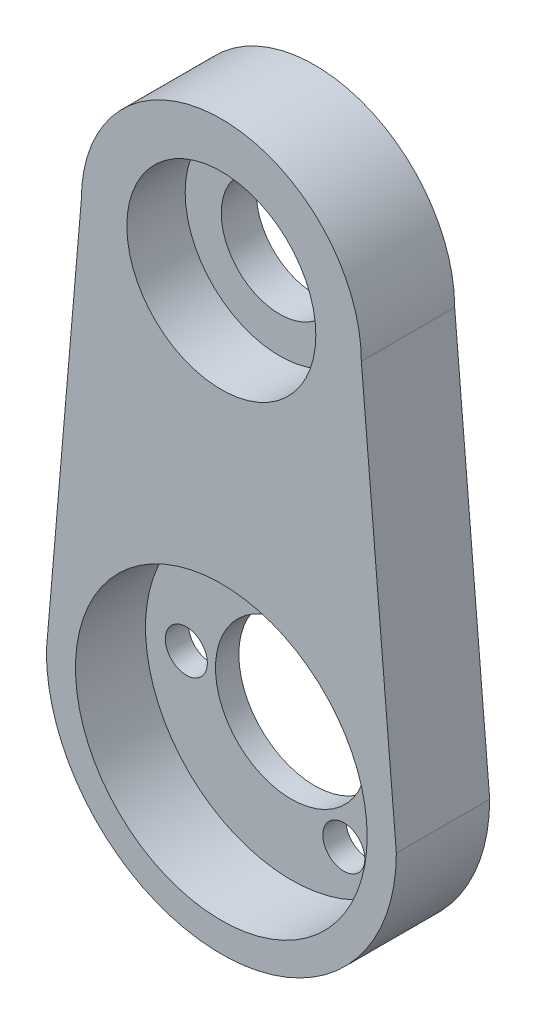
ISO-10303-21;
HEADER;
FILE_DESCRIPTION(('STEP AP214'),'2;1');
FILE_NAME('part.step','',(''),(''),'','','');
FILE_SCHEMA(('AUTOMOTIVE_DESIGN { 1 0 10303 214 1 1 1 1 }'));
ENDSEC;
DATA;
#1=APPLICATION_CONTEXT('core data for automotive mechanical design processes');
#2=APPLICATION_PROTOCOL_DEFINITION('international standard','automotive_design',2000,#1);
#3=PRODUCT_CONTEXT('',#1,'mechanical');
#4=PRODUCT('Part','Part','',(#3));
#5=PRODUCT_RELATED_PRODUCT_CATEGORY('part','',(#4));
#6=PRODUCT_DEFINITION_FORMATION('','',#4);
#7=PRODUCT_DEFINITION_CONTEXT('part definition',#1,'design');
#8=PRODUCT_DEFINITION('design','',#6,#7);
#9=PRODUCT_DEFINITION_SHAPE('','',#8);
#10=(LENGTH_UNIT() NAMED_UNIT(*) SI_UNIT(.MILLI.,.METRE.));
#11=(NAMED_UNIT(*) PLANE_ANGLE_UNIT() SI_UNIT($,.RADIAN.));
#12=(NAMED_UNIT(*) SI_UNIT($,.STERADIAN.) SOLID_ANGLE_UNIT());
#13=UNCERTAINTY_MEASURE_WITH_UNIT(LENGTH_MEASURE(1.E-05),#10,'distance_accuracy_value','');
#14=(GEOMETRIC_REPRESENTATION_CONTEXT(3) GLOBAL_UNCERTAINTY_ASSIGNED_CONTEXT((#13)) GLOBAL_UNIT_ASSIGNED_CONTEXT((#10,
#11,#12)) REPRESENTATION_CONTEXT('',''));
#15=CARTESIAN_POINT('',(0.,0.,0.));
#16=DIRECTION('',(0.,0.,1.));
#17=DIRECTION('',(1.,0.,0.));
#18=AXIS2_PLACEMENT_3D('',#15,#16,#17);
#19=CARTESIAN_POINT('',(0.,0.,-2.));
#20=DIRECTION('',(0.,0.,1.));
#21=DIRECTION('',(1.,0.,0.));
#22=AXIS2_PLACEMENT_3D('',#19,#20,#21);
#23=CYLINDRICAL_SURFACE('',#22,8.1);
#24=CARTESIAN_POINT('',(0.,0.,8.));
#25=DIRECTION('',(0.,0.,1.));
#26=DIRECTION('',(1.,0.,0.));
#27=AXIS2_PLACEMENT_3D('',#24,#25,#26);
#28=CIRCLE('',#27,8.1);
#29=CARTESIAN_POINT('',(8.1,0.,8.));
#30=VERTEX_POINT('',#29);
#31=EDGE_CURVE('E166',#30,#30,#28,.T.);
#32=ORIENTED_EDGE('',*,*,#31,.T.);
#33=EDGE_LOOP('',(#32));
#34=FACE_BOUND('',#33,.T.);
#35=CARTESIAN_POINT('',(0.,0.,3.));
#36=DIRECTION('',(0.,0.,-1.));
#37=DIRECTION('',(-1.,0.,0.));
#38=AXIS2_PLACEMENT_3D('',#35,#36,#37);
#39=CIRCLE('',#38,8.1);
#40=CARTESIAN_POINT('',(-8.1,0.,3.));
#41=VERTEX_POINT('',#40);
#42=EDGE_CURVE('E11',#41,#41,#39,.F.);
#43=ORIENTED_EDGE('',*,*,#42,.F.);
#44=EDGE_LOOP('',(#43));
#45=FACE_BOUND('',#44,.T.);
#46=ADVANCED_FACE('F42',(#34,#45),#23,.F.);
#47=CARTESIAN_POINT('',(0.,-35.,-2.));
#48=DIRECTION('',(0.,0.,1.));
#49=DIRECTION('',(1.,0.,0.));
#50=AXIS2_PLACEMENT_3D('',#47,#48,#49);
#51=CYLINDRICAL_SURFACE('',#50,6.5);
#52=CARTESIAN_POINT('',(0.,-35.,0.));
#53=DIRECTION('',(0.,0.,-1.));
#54=DIRECTION('',(-1.,0.,0.));
#55=AXIS2_PLACEMENT_3D('',#52,#53,#54);
#56=CIRCLE('',#55,6.5);
#57=CARTESIAN_POINT('',(-6.5,-35.,0.));
#58=VERTEX_POINT('',#57);
#59=EDGE_CURVE('E120',#58,#58,#56,.T.);
#60=ORIENTED_EDGE('',*,*,#59,.T.);
#61=EDGE_LOOP('',(#60));
#62=FACE_BOUND('',#61,.T.);
#63=CARTESIAN_POINT('',(0.,-35.,2.));
#64=DIRECTION('',(0.,0.,1.));
#65=DIRECTION('',(1.,0.,0.));
#66=AXIS2_PLACEMENT_3D('',#63,#64,#65);
#67=CIRCLE('',#66,6.5);
#68=CARTESIAN_POINT('',(6.5,-35.,2.));
#69=VERTEX_POINT('',#68);
#70=EDGE_CURVE('E141',#69,#69,#67,.F.);
#71=ORIENTED_EDGE('',*,*,#70,.F.);
#72=EDGE_LOOP('',(#71));
#73=FACE_BOUND('',#72,.T.);
#74=ADVANCED_FACE('F181',(#62,#73),#51,.F.);
#75=CARTESIAN_POINT('',(-8.99999999999999,-35.,-2.));
#76=DIRECTION('',(0.,0.,1.));
#77=DIRECTION('',(1.,0.,0.));
#78=AXIS2_PLACEMENT_3D('',#75,#76,#77);
#79=CYLINDRICAL_SURFACE('',#78,1.8);
#80=CARTESIAN_POINT('',(-8.99999999999999,-35.,0.));
#81=DIRECTION('',(0.,0.,-1.));
#82=DIRECTION('',(-1.,0.,0.));
#83=AXIS2_PLACEMENT_3D('',#80,#81,#82);
#84=CIRCLE('',#83,1.8);
#85=CARTESIAN_POINT('',(-10.8,-35.,0.));
#86=VERTEX_POINT('',#85);
#87=EDGE_CURVE('E136',#86,#86,#84,.T.);
#88=ORIENTED_EDGE('',*,*,#87,.T.);
#89=EDGE_LOOP('',(#88));
#90=FACE_BOUND('',#89,.T.);
#91=CARTESIAN_POINT('',(-8.99999999999999,-35.,2.));
#92=DIRECTION('',(0.,0.,1.));
#93=DIRECTION('',(1.,0.,0.));
#94=AXIS2_PLACEMENT_3D('',#91,#92,#93);
#95=CIRCLE('',#94,1.8);
#96=CARTESIAN_POINT('',(-7.19999999999999,-35.,2.));
#97=VERTEX_POINT('',#96);
#98=EDGE_CURVE('E157',#97,#97,#95,.F.);
#99=ORIENTED_EDGE('',*,*,#98,.F.);
#100=EDGE_LOOP('',(#99));
#101=FACE_BOUND('',#100,.T.);
#102=ADVANCED_FACE('F183',(#90,#101),#79,.F.);
#103=CARTESIAN_POINT('',(4.5000000000001,-42.7942286340599,-2.));
#104=DIRECTION('',(0.,0.,1.));
#105=DIRECTION('',(1.,0.,0.));
#106=AXIS2_PLACEMENT_3D('',#103,#104,#105);
#107=CYLINDRICAL_SURFACE('',#106,1.8);
#108=CARTESIAN_POINT('',(4.5000000000001,-42.7942286340599,0.));
#109=DIRECTION('',(0.,0.,-1.));
#110=DIRECTION('',(-1.,0.,0.));
#111=AXIS2_PLACEMENT_3D('',#108,#109,#110);
#112=CIRCLE('',#111,1.8);
#113=CARTESIAN_POINT('',(2.7000000000001,-42.7942286340599,0.));
#114=VERTEX_POINT('',#113);
#115=EDGE_CURVE('E140',#114,#114,#112,.T.);
#116=ORIENTED_EDGE('',*,*,#115,.T.);
#117=EDGE_LOOP('',(#116));
#118=FACE_BOUND('',#117,.T.);
#119=CARTESIAN_POINT('',(4.5000000000001,-42.7942286340599,2.));
#120=DIRECTION('',(0.,0.,1.));
#121=DIRECTION('',(1.,0.,0.));
#122=AXIS2_PLACEMENT_3D('',#119,#120,#121);
#123=CIRCLE('',#122,1.8);
#124=CARTESIAN_POINT('',(6.3000000000001,-42.7942286340599,2.));
#125=VERTEX_POINT('',#124);
#126=EDGE_CURVE('E150',#125,#125,#123,.F.);
#127=ORIENTED_EDGE('',*,*,#126,.F.);
#128=EDGE_LOOP('',(#127));
#129=FACE_BOUND('',#128,.T.);
#130=ADVANCED_FACE('F190',(#118,#129),#107,.F.);
#131=CARTESIAN_POINT('',(4.50000000000004,-27.2057713659401,-2.));
#132=DIRECTION('',(0.,0.,1.));
#133=DIRECTION('',(1.,0.,0.));
#134=AXIS2_PLACEMENT_3D('',#131,#132,#133);
#135=CYLINDRICAL_SURFACE('',#134,1.8);
#136=CARTESIAN_POINT('',(4.50000000000004,-27.2057713659401,0.));
#137=DIRECTION('',(0.,0.,-1.));
#138=DIRECTION('',(-1.,0.,0.));
#139=AXIS2_PLACEMENT_3D('',#136,#137,#138);
#140=CIRCLE('',#139,1.8);
#141=CARTESIAN_POINT('',(2.70000000000004,-27.2057713659401,0.));
#142=VERTEX_POINT('',#141);
#143=EDGE_CURVE('E135',#142,#142,#140,.T.);
#144=ORIENTED_EDGE('',*,*,#143,.T.);
#145=EDGE_LOOP('',(#144));
#146=FACE_BOUND('',#145,.T.);
#147=CARTESIAN_POINT('',(4.50000000000004,-27.2057713659401,2.));
#148=DIRECTION('',(0.,0.,1.));
#149=DIRECTION('',(1.,0.,0.));
#150=AXIS2_PLACEMENT_3D('',#147,#148,#149);
#151=CIRCLE('',#150,1.8);
#152=CARTESIAN_POINT('',(6.30000000000004,-27.2057713659401,2.));
#153=VERTEX_POINT('',#152);
#154=EDGE_CURVE('E147',#153,#153,#151,.F.);
#155=ORIENTED_EDGE('',*,*,#154,.F.);
#156=EDGE_LOOP('',(#155));
#157=FACE_BOUND('',#156,.T.);
#158=ADVANCED_FACE('F212',(#146,#157),#135,.F.);
#159=CARTESIAN_POINT('',(0.,0.,8.));
#160=DIRECTION('',(0.,0.,-1.));
#161=DIRECTION('',(-1.,0.,0.));
#162=AXIS2_PLACEMENT_3D('',#159,#160,#161);
#163=CYLINDRICAL_SURFACE('',#162,12.);
#164=CARTESIAN_POINT('',(0.,0.,0.));
#165=DIRECTION('',(0.,0.,1.));
#166=DIRECTION('',(-1.,0.,0.));
#167=AXIS2_PLACEMENT_3D('',#164,#165,#166);
#168=CIRCLE('',#167,12.);
#169=CARTESIAN_POINT('',(12.,0.,0.));
#170=VERTEX_POINT('',#169);
#171=CARTESIAN_POINT('',(-12.,0.,0.));
#172=VERTEX_POINT('',#171);
#173=EDGE_CURVE('E116',#170,#172,#168,.T.);
#174=ORIENTED_EDGE('',*,*,#173,.T.);
#175=DIRECTION('',(0.,0.,-1.));
#176=VECTOR('',#175,1.);
#177=CARTESIAN_POINT('',(-12.,0.,8.));
#178=LINE('',#177,#176);
#179=CARTESIAN_POINT('',(-12.,0.,8.));
#180=VERTEX_POINT('',#179);
#181=EDGE_CURVE('E52',#180,#172,#178,.T.);
#182=ORIENTED_EDGE('',*,*,#181,.F.);
#183=CARTESIAN_POINT('',(0.,0.,8.));
#184=DIRECTION('',(0.,0.,1.));
#185=DIRECTION('',(-1.,0.,0.));
#186=AXIS2_PLACEMENT_3D('',#183,#184,#185);
#187=CIRCLE('',#186,12.);
#188=CARTESIAN_POINT('',(12.,0.,8.));
#189=VERTEX_POINT('',#188);
#190=EDGE_CURVE('E96',#189,#180,#187,.T.);
#191=ORIENTED_EDGE('',*,*,#190,.F.);
#192=DIRECTION('',(0.,0.,-1.));
#193=VECTOR('',#192,1.);
#194=CARTESIAN_POINT('',(12.,0.,8.));
#195=LINE('',#194,#193);
#196=EDGE_CURVE('E112',#189,#170,#195,.T.);
#197=ORIENTED_EDGE('',*,*,#196,.T.);
#198=EDGE_LOOP('',(#174,#182,#191,#197));
#199=FACE_BOUND('',#198,.T.);
#200=ADVANCED_FACE('F44',(#199),#163,.T.);
#201=CARTESIAN_POINT('',(-12.,0.,8.));
#202=DIRECTION('',(0.996346649041751,-0.0854011413464357,0.));
#203=DIRECTION('',(0.0854011413464357,0.996346649041751,0.));
#204=AXIS2_PLACEMENT_3D('',#201,#202,#203);
#205=PLANE('',#204);
#206=DIRECTION('',(-0.0854011413464357,-0.996346649041751,0.));
#207=VECTOR('',#206,1.);
#208=CARTESIAN_POINT('',(-12.,0.,0.));
#209=LINE('',#208,#207);
#210=CARTESIAN_POINT('',(-15.,-35.,0.));
#211=VERTEX_POINT('',#210);
#212=EDGE_CURVE('E102',#172,#211,#209,.T.);
#213=ORIENTED_EDGE('',*,*,#212,.T.);
#214=DIRECTION('',(0.,0.,-1.));
#215=VECTOR('',#214,1.);
#216=CARTESIAN_POINT('',(-15.,-35.,8.));
#217=LINE('',#216,#215);
#218=CARTESIAN_POINT('',(-15.,-35.,8.));
#219=VERTEX_POINT('',#218);
#220=EDGE_CURVE('E100',#219,#211,#217,.T.);
#221=ORIENTED_EDGE('',*,*,#220,.F.);
#222=DIRECTION('',(-0.0854011413464357,-0.996346649041751,0.));
#223=VECTOR('',#222,1.);
#224=CARTESIAN_POINT('',(-12.,0.,8.));
#225=LINE('',#224,#223);
#226=EDGE_CURVE('E91',#180,#219,#225,.T.);
#227=ORIENTED_EDGE('',*,*,#226,.F.);
#228=ORIENTED_EDGE('',*,*,#181,.T.);
#229=EDGE_LOOP('',(#213,#221,#227,#228));
#230=FACE_BOUND('',#229,.T.);
#231=ADVANCED_FACE('F101',(#230),#205,.F.);
#232=CARTESIAN_POINT('',(0.,-35.,8.));
#233=DIRECTION('',(0.,0.,-1.));
#234=DIRECTION('',(-1.,0.,0.));
#235=AXIS2_PLACEMENT_3D('',#232,#233,#234);
#236=CYLINDRICAL_SURFACE('',#235,15.);
#237=CARTESIAN_POINT('',(0.,-35.,0.));
#238=DIRECTION('',(0.,0.,1.));
#239=DIRECTION('',(1.,0.,0.));
#240=AXIS2_PLACEMENT_3D('',#237,#238,#239);
#241=CIRCLE('',#240,15.);
#242=CARTESIAN_POINT('',(15.,-35.,0.));
#243=VERTEX_POINT('',#242);
#244=EDGE_CURVE('E77',#211,#243,#241,.T.);
#245=ORIENTED_EDGE('',*,*,#244,.T.);
#246=DIRECTION('',(0.,0.,-1.));
#247=VECTOR('',#246,1.);
#248=CARTESIAN_POINT('',(15.,-35.,8.));
#249=LINE('',#248,#247);
#250=CARTESIAN_POINT('',(15.,-35.,8.));
#251=VERTEX_POINT('',#250);
#252=EDGE_CURVE('E104',#251,#243,#249,.T.);
#253=ORIENTED_EDGE('',*,*,#252,.F.);
#254=CARTESIAN_POINT('',(0.,-35.,8.));
#255=DIRECTION('',(0.,0.,1.));
#256=DIRECTION('',(1.,0.,0.));
#257=AXIS2_PLACEMENT_3D('',#254,#255,#256);
#258=CIRCLE('',#257,15.);
#259=EDGE_CURVE('E94',#219,#251,#258,.T.);
#260=ORIENTED_EDGE('',*,*,#259,.F.);
#261=ORIENTED_EDGE('',*,*,#220,.T.);
#262=EDGE_LOOP('',(#245,#253,#260,#261));
#263=FACE_BOUND('',#262,.T.);
#264=ADVANCED_FACE('F106',(#263),#236,.T.);
#265=CARTESIAN_POINT('',(12.,0.,8.));
#266=DIRECTION('',(-0.996346649041751,-0.0854011413464357,0.));
#267=DIRECTION('',(0.0854011413464357,-0.996346649041751,0.));
#268=AXIS2_PLACEMENT_3D('',#265,#266,#267);
#269=PLANE('',#268);
#270=DIRECTION('',(-0.0854011413464357,0.996346649041751,0.));
#271=VECTOR('',#270,1.);
#272=CARTESIAN_POINT('',(12.,0.,0.));
#273=LINE('',#272,#271);
#274=EDGE_CURVE('E83',#243,#170,#273,.T.);
#275=ORIENTED_EDGE('',*,*,#274,.T.);
#276=ORIENTED_EDGE('',*,*,#196,.F.);
#277=DIRECTION('',(-0.0854011413464357,0.996346649041751,0.));
#278=VECTOR('',#277,1.);
#279=CARTESIAN_POINT('',(12.,0.,8.));
#280=LINE('',#279,#278);
#281=EDGE_CURVE('E60',#251,#189,#280,.T.);
#282=ORIENTED_EDGE('',*,*,#281,.F.);
#283=ORIENTED_EDGE('',*,*,#252,.T.);
#284=EDGE_LOOP('',(#275,#276,#282,#283));
#285=FACE_BOUND('',#284,.T.);
#286=ADVANCED_FACE('F200',(#285),#269,.F.);
#287=CARTESIAN_POINT('',(0.,0.,8.));
#288=DIRECTION('',(0.,0.,-1.));
#289=DIRECTION('',(-1.,0.,0.));
#290=AXIS2_PLACEMENT_3D('',#287,#288,#289);
#291=PLANE('',#290);
#292=ORIENTED_EDGE('',*,*,#31,.F.);
#293=EDGE_LOOP('',(#292));
#294=FACE_BOUND('',#293,.T.);
#295=CARTESIAN_POINT('',(0.,-35.,8.));
#296=DIRECTION('',(0.,0.,1.));
#297=DIRECTION('',(1.,0.,0.));
#298=AXIS2_PLACEMENT_3D('',#295,#296,#297);
#299=CIRCLE('',#298,12.5);
#300=CARTESIAN_POINT('',(12.5,-35.,8.));
#301=VERTEX_POINT('',#300);
#302=EDGE_CURVE('E160',#301,#301,#299,.T.);
#303=ORIENTED_EDGE('',*,*,#302,.F.);
#304=EDGE_LOOP('',(#303));
#305=FACE_BOUND('',#304,.T.);
#306=ORIENTED_EDGE('',*,*,#190,.T.);
#307=ORIENTED_EDGE('',*,*,#226,.T.);
#308=ORIENTED_EDGE('',*,*,#259,.T.);
#309=ORIENTED_EDGE('',*,*,#281,.T.);
#310=EDGE_LOOP('',(#306,#307,#308,#309));
#311=FACE_BOUND('',#310,.T.);
#312=ADVANCED_FACE('F92',(#294,#305,#311),#291,.F.);
#313=CARTESIAN_POINT('',(0.,0.,0.));
#314=DIRECTION('',(0.,0.,-1.));
#315=DIRECTION('',(-1.,0.,0.));
#316=AXIS2_PLACEMENT_3D('',#313,#314,#315);
#317=PLANE('',#316);
#318=ORIENTED_EDGE('',*,*,#143,.F.);
#319=EDGE_LOOP('',(#318));
#320=FACE_BOUND('',#319,.T.);
#321=ORIENTED_EDGE('',*,*,#115,.F.);
#322=EDGE_LOOP('',(#321));
#323=FACE_BOUND('',#322,.T.);
#324=ORIENTED_EDGE('',*,*,#87,.F.);
#325=EDGE_LOOP('',(#324));
#326=FACE_BOUND('',#325,.T.);
#327=ORIENTED_EDGE('',*,*,#59,.F.);
#328=EDGE_LOOP('',(#327));
#329=FACE_BOUND('',#328,.T.);
#330=ORIENTED_EDGE('',*,*,#173,.F.);
#331=ORIENTED_EDGE('',*,*,#274,.F.);
#332=ORIENTED_EDGE('',*,*,#244,.F.);
#333=ORIENTED_EDGE('',*,*,#212,.F.);
#334=EDGE_LOOP('',(#330,#331,#332,#333));
#335=FACE_BOUND('',#334,.T.);
#336=CARTESIAN_POINT('',(0.,0.,0.));
#337=DIRECTION('',(0.,0.,-1.));
#338=DIRECTION('',(-1.,0.,0.));
#339=AXIS2_PLACEMENT_3D('',#336,#337,#338);
#340=CIRCLE('',#339,5.);
#341=CARTESIAN_POINT('',(-5.,0.,0.));
#342=VERTEX_POINT('',#341);
#343=EDGE_CURVE('E224',#342,#342,#340,.T.);
#344=ORIENTED_EDGE('',*,*,#343,.F.);
#345=EDGE_LOOP('',(#344));
#346=FACE_BOUND('',#345,.T.);
#347=ADVANCED_FACE('F199',(#320,#323,#326,#329,#335,#346),#317,.T.);
#348=CARTESIAN_POINT('',(0.,-35.,2.));
#349=DIRECTION('',(0.,0.,1.));
#350=DIRECTION('',(1.,0.,0.));
#351=AXIS2_PLACEMENT_3D('',#348,#349,#350);
#352=PLANE('',#351);
#353=CARTESIAN_POINT('',(0.,-35.,2.));
#354=DIRECTION('',(0.,0.,1.));
#355=DIRECTION('',(1.,0.,0.));
#356=AXIS2_PLACEMENT_3D('',#353,#354,#355);
#357=CIRCLE('',#356,12.5);
#358=CARTESIAN_POINT('',(12.5,-35.,2.));
#359=VERTEX_POINT('',#358);
#360=EDGE_CURVE('E151',#359,#359,#357,.T.);
#361=ORIENTED_EDGE('',*,*,#360,.T.);
#362=EDGE_LOOP('',(#361));
#363=FACE_BOUND('',#362,.T.);
#364=ORIENTED_EDGE('',*,*,#154,.T.);
#365=EDGE_LOOP('',(#364));
#366=FACE_BOUND('',#365,.T.);
#367=ORIENTED_EDGE('',*,*,#126,.T.);
#368=EDGE_LOOP('',(#367));
#369=FACE_BOUND('',#368,.T.);
#370=ORIENTED_EDGE('',*,*,#98,.T.);
#371=EDGE_LOOP('',(#370));
#372=FACE_BOUND('',#371,.T.);
#373=ORIENTED_EDGE('',*,*,#70,.T.);
#374=EDGE_LOOP('',(#373));
#375=FACE_BOUND('',#374,.T.);
#376=ADVANCED_FACE('F179',(#363,#366,#369,#372,#375),#352,.T.);
#377=CARTESIAN_POINT('',(0.,-35.,2.));
#378=DIRECTION('',(0.,0.,1.));
#379=DIRECTION('',(1.,0.,0.));
#380=AXIS2_PLACEMENT_3D('',#377,#378,#379);
#381=CYLINDRICAL_SURFACE('',#380,12.5);
#382=ORIENTED_EDGE('',*,*,#360,.F.);
#383=EDGE_LOOP('',(#382));
#384=FACE_BOUND('',#383,.T.);
#385=ORIENTED_EDGE('',*,*,#302,.T.);
#386=EDGE_LOOP('',(#385));
#387=FACE_BOUND('',#386,.T.);
#388=ADVANCED_FACE('F239',(#384,#387),#381,.F.);
#389=CARTESIAN_POINT('',(0.,0.,3.));
#390=DIRECTION('',(0.,0.,-1.));
#391=DIRECTION('',(-1.,0.,0.));
#392=AXIS2_PLACEMENT_3D('',#389,#390,#391);
#393=PLANE('',#392);
#394=CARTESIAN_POINT('',(0.,0.,3.));
#395=DIRECTION('',(0.,0.,-1.));
#396=DIRECTION('',(-1.,0.,0.));
#397=AXIS2_PLACEMENT_3D('',#394,#395,#396);
#398=CIRCLE('',#397,5.);
#399=CARTESIAN_POINT('',(-5.,0.,3.));
#400=VERTEX_POINT('',#399);
#401=EDGE_CURVE('E227',#400,#400,#398,.T.);
#402=ORIENTED_EDGE('',*,*,#401,.T.);
#403=EDGE_LOOP('',(#402));
#404=FACE_BOUND('',#403,.T.);
#405=ORIENTED_EDGE('',*,*,#42,.T.);
#406=EDGE_LOOP('',(#405));
#407=FACE_BOUND('',#406,.T.);
#408=ADVANCED_FACE('F241',(#404,#407),#393,.F.);
#409=CARTESIAN_POINT('',(0.,0.,3.));
#410=DIRECTION('',(0.,0.,-1.));
#411=DIRECTION('',(-1.,0.,0.));
#412=AXIS2_PLACEMENT_3D('',#409,#410,#411);
#413=CYLINDRICAL_SURFACE('',#412,5.);
#414=ORIENTED_EDGE('',*,*,#401,.F.);
#415=EDGE_LOOP('',(#414));
#416=FACE_BOUND('',#415,.T.);
#417=ORIENTED_EDGE('',*,*,#343,.T.);
#418=EDGE_LOOP('',(#417));
#419=FACE_BOUND('',#418,.T.);
#420=ADVANCED_FACE('F248',(#416,#419),#413,.F.);
#421=CLOSED_SHELL('',(#46,#74,#102,#130,#158,#200,#231,#264,#286,#312,#347,#376,#388,#408,#420));
#422=MANIFOLD_SOLID_BREP('B2',#421);
#423=ADVANCED_BREP_SHAPE_REPRESENTATION('',(#18,#422),#14);
#424=SHAPE_DEFINITION_REPRESENTATION(#9,#423);
ENDSEC;
END-ISO-10303-21;
